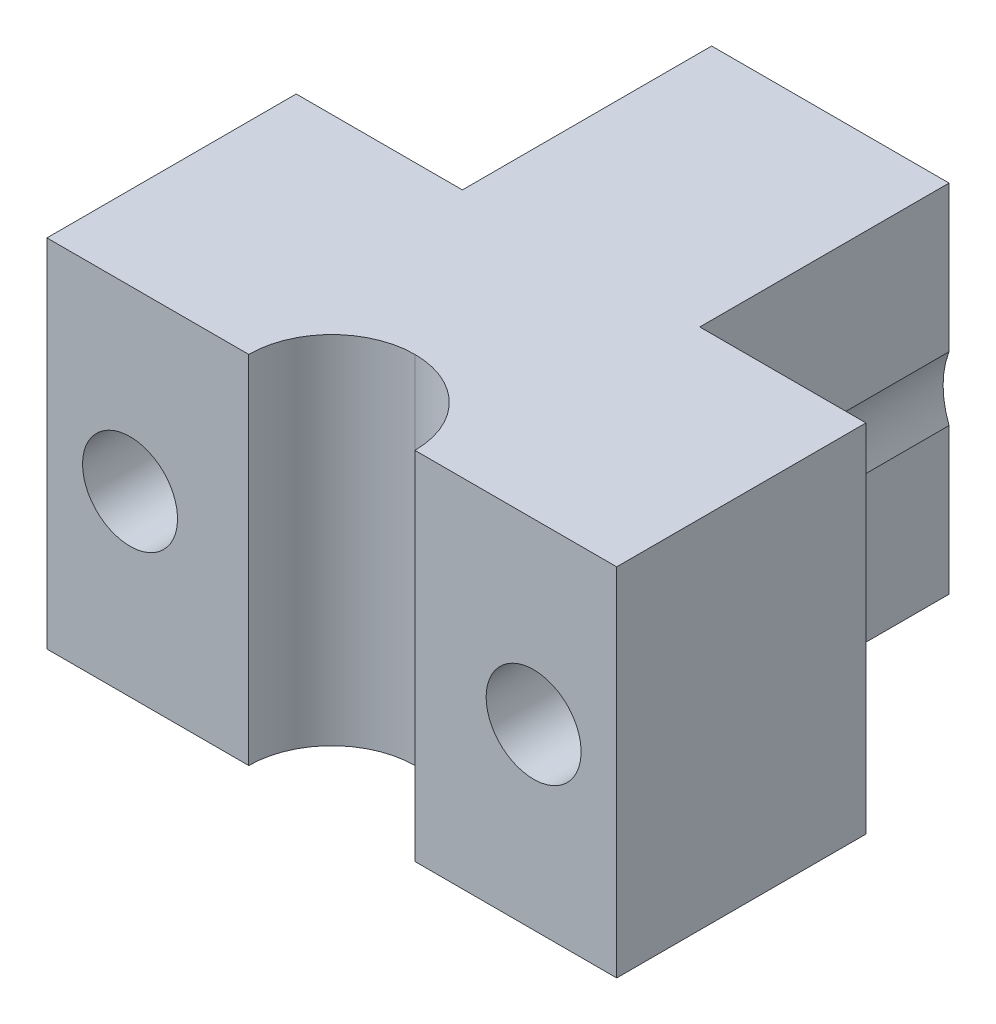
ISO-10303-21;
HEADER;
FILE_DESCRIPTION(('STEP AP214'),'2;1');
FILE_NAME('part.step','',(''),(''),'','','');
FILE_SCHEMA(('AUTOMOTIVE_DESIGN { 1 0 10303 214 1 1 1 1 }'));
ENDSEC;
DATA;
#1=APPLICATION_CONTEXT('core data for automotive mechanical design processes');
#2=APPLICATION_PROTOCOL_DEFINITION('international standard','automotive_design',2000,#1);
#3=PRODUCT_CONTEXT('',#1,'mechanical');
#4=PRODUCT('Part','Part','',(#3));
#5=PRODUCT_RELATED_PRODUCT_CATEGORY('part','',(#4));
#6=PRODUCT_DEFINITION_FORMATION('','',#4);
#7=PRODUCT_DEFINITION_CONTEXT('part definition',#1,'design');
#8=PRODUCT_DEFINITION('design','',#6,#7);
#9=PRODUCT_DEFINITION_SHAPE('','',#8);
#10=(LENGTH_UNIT() NAMED_UNIT(*) SI_UNIT(.MILLI.,.METRE.));
#11=(NAMED_UNIT(*) PLANE_ANGLE_UNIT() SI_UNIT($,.RADIAN.));
#12=(NAMED_UNIT(*) SI_UNIT($,.STERADIAN.) SOLID_ANGLE_UNIT());
#13=UNCERTAINTY_MEASURE_WITH_UNIT(LENGTH_MEASURE(1.E-05),#10,'distance_accuracy_value','');
#14=(GEOMETRIC_REPRESENTATION_CONTEXT(3) GLOBAL_UNCERTAINTY_ASSIGNED_CONTEXT((#13)) GLOBAL_UNIT_ASSIGNED_CONTEXT((#10,
#11,#12)) REPRESENTATION_CONTEXT('',''));
#15=CARTESIAN_POINT('',(0.,0.,0.));
#16=DIRECTION('',(0.,0.,1.));
#17=DIRECTION('',(1.,0.,0.));
#18=AXIS2_PLACEMENT_3D('',#15,#16,#17);
#19=CARTESIAN_POINT('',(-10.,0.,0.));
#20=DIRECTION('',(1.,0.,0.));
#21=DIRECTION('',(0.,0.,-1.));
#22=AXIS2_PLACEMENT_3D('',#19,#20,#21);
#23=PLANE('',#22);
#24=DIRECTION('',(0.,0.,1.));
#25=VECTOR('',#24,1.);
#26=CARTESIAN_POINT('',(-10.,17.6925824035673,-32.));
#27=LINE('',#26,#25);
#28=CARTESIAN_POINT('',(-10.,17.6925824035673,-11.));
#29=VERTEX_POINT('',#28);
#30=CARTESIAN_POINT('',(-10.,17.6925824035673,-16.4));
#31=VERTEX_POINT('',#30);
#32=EDGE_CURVE('E11',#29,#31,#27,.F.);
#33=ORIENTED_EDGE('',*,*,#32,.F.);
#34=DIRECTION('',(0.,1.,0.));
#35=VECTOR('',#34,1.);
#36=CARTESIAN_POINT('',(-10.,0.,-11.));
#37=LINE('',#36,#35);
#38=CARTESIAN_POINT('',(-10.,30.,-11.));
#39=VERTEX_POINT('',#38);
#40=EDGE_CURVE('E186',#29,#39,#37,.T.);
#41=ORIENTED_EDGE('',*,*,#40,.T.);
#42=DIRECTION('',(0.,0.,-1.));
#43=VECTOR('',#42,1.);
#44=CARTESIAN_POINT('',(-10.,30.,-11.));
#45=LINE('',#44,#43);
#46=CARTESIAN_POINT('',(-10.,30.,-32.));
#47=VERTEX_POINT('',#46);
#48=EDGE_CURVE('E198',#39,#47,#45,.T.);
#49=ORIENTED_EDGE('',*,*,#48,.T.);
#50=DIRECTION('',(0.,-1.,0.));
#51=VECTOR('',#50,1.);
#52=CARTESIAN_POINT('',(-10.,0.,-32.));
#53=LINE('',#52,#51);
#54=CARTESIAN_POINT('',(-10.,17.6925824035673,-32.));
#55=VERTEX_POINT('',#54);
#56=EDGE_CURVE('E206',#47,#55,#53,.T.);
#57=ORIENTED_EDGE('',*,*,#56,.T.);
#58=CARTESIAN_POINT('',(-10.,17.6925824035673,-26.6));
#59=VERTEX_POINT('',#58);
#60=EDGE_CURVE('E41',#59,#55,#27,.F.);
#61=ORIENTED_EDGE('',*,*,#60,.F.);
#62=DIRECTION('',(0.,-1.,0.));
#63=VECTOR('',#62,1.);
#64=CARTESIAN_POINT('',(-10.,4.9,-26.6));
#65=LINE('',#64,#63);
#66=CARTESIAN_POINT('',(-10.,25.1,-26.6));
#67=VERTEX_POINT('',#66);
#68=EDGE_CURVE('E352',#67,#59,#65,.T.);
#69=ORIENTED_EDGE('',*,*,#68,.F.);
#70=DIRECTION('',(0.,0.,-1.));
#71=VECTOR('',#70,1.);
#72=CARTESIAN_POINT('',(-10.,25.1,-16.4));
#73=LINE('',#72,#71);
#74=CARTESIAN_POINT('',(-10.,25.1,-16.4));
#75=VERTEX_POINT('',#74);
#76=EDGE_CURVE('E348',#75,#67,#73,.T.);
#77=ORIENTED_EDGE('',*,*,#76,.F.);
#78=DIRECTION('',(0.,1.,0.));
#79=VECTOR('',#78,1.);
#80=CARTESIAN_POINT('',(-10.,4.9,-16.4));
#81=LINE('',#80,#79);
#82=EDGE_CURVE('E189',#31,#75,#81,.T.);
#83=ORIENTED_EDGE('',*,*,#82,.F.);
#84=EDGE_LOOP('',(#33,#41,#49,#57,#61,#69,#77,#83));
#85=FACE_BOUND('',#84,.T.);
#86=ADVANCED_FACE('F37',(#85),#23,.F.);
#87=DIRECTION('',(0.,0.,1.));
#88=VECTOR('',#87,1.);
#89=CARTESIAN_POINT('',(-10.,12.3074175964327,-32.));
#90=LINE('',#89,#88);
#91=CARTESIAN_POINT('',(-10.,12.3074175964327,-32.));
#92=VERTEX_POINT('',#91);
#93=CARTESIAN_POINT('',(-10.,12.3074175964327,-26.6));
#94=VERTEX_POINT('',#93);
#95=EDGE_CURVE('E287',#92,#94,#90,.T.);
#96=ORIENTED_EDGE('',*,*,#95,.F.);
#97=CARTESIAN_POINT('',(-10.,0.,-32.));
#98=VERTEX_POINT('',#97);
#99=EDGE_CURVE('E205',#92,#98,#53,.T.);
#100=ORIENTED_EDGE('',*,*,#99,.T.);
#101=DIRECTION('',(0.,0.,1.));
#102=VECTOR('',#101,1.);
#103=CARTESIAN_POINT('',(-10.,0.,-11.));
#104=LINE('',#103,#102);
#105=CARTESIAN_POINT('',(-10.,0.,-11.));
#106=VERTEX_POINT('',#105);
#107=EDGE_CURVE('E196',#98,#106,#104,.T.);
#108=ORIENTED_EDGE('',*,*,#107,.T.);
#109=CARTESIAN_POINT('',(-10.,12.3074175964327,-11.));
#110=VERTEX_POINT('',#109);
#111=EDGE_CURVE('E195',#106,#110,#37,.T.);
#112=ORIENTED_EDGE('',*,*,#111,.T.);
#113=CARTESIAN_POINT('',(-10.,12.3074175964327,-16.4));
#114=VERTEX_POINT('',#113);
#115=EDGE_CURVE('E181',#114,#110,#90,.T.);
#116=ORIENTED_EDGE('',*,*,#115,.F.);
#117=CARTESIAN_POINT('',(-10.,4.9,-16.4));
#118=VERTEX_POINT('',#117);
#119=EDGE_CURVE('E345',#118,#114,#81,.T.);
#120=ORIENTED_EDGE('',*,*,#119,.F.);
#121=DIRECTION('',(0.,0.,1.));
#122=VECTOR('',#121,1.);
#123=CARTESIAN_POINT('',(-10.,4.9,-16.4));
#124=LINE('',#123,#122);
#125=CARTESIAN_POINT('',(-10.,4.9,-26.6));
#126=VERTEX_POINT('',#125);
#127=EDGE_CURVE('E340',#126,#118,#124,.T.);
#128=ORIENTED_EDGE('',*,*,#127,.F.);
#129=EDGE_CURVE('E351',#94,#126,#65,.T.);
#130=ORIENTED_EDGE('',*,*,#129,.F.);
#131=EDGE_LOOP('',(#96,#100,#108,#112,#116,#120,#128,#130));
#132=FACE_BOUND('',#131,.T.);
#133=ADVANCED_FACE('F373',(#132),#23,.F.);
#134=CARTESIAN_POINT('',(10.,0.,0.));
#135=DIRECTION('',(1.,0.,0.));
#136=DIRECTION('',(0.,0.,-1.));
#137=AXIS2_PLACEMENT_3D('',#134,#135,#136);
#138=PLANE('',#137);
#139=DIRECTION('',(0.,-1.,0.));
#140=VECTOR('',#139,1.);
#141=CARTESIAN_POINT('',(10.,0.,-11.));
#142=LINE('',#141,#140);
#143=CARTESIAN_POINT('',(10.,30.,-11.));
#144=VERTEX_POINT('',#143);
#145=CARTESIAN_POINT('',(10.,17.6925824035672,-11.));
#146=VERTEX_POINT('',#145);
#147=EDGE_CURVE('E225',#144,#146,#142,.T.);
#148=ORIENTED_EDGE('',*,*,#147,.T.);
#149=DIRECTION('',(0.,0.,1.));
#150=VECTOR('',#149,1.);
#151=CARTESIAN_POINT('',(10.,17.6925824035672,-32.));
#152=LINE('',#151,#150);
#153=CARTESIAN_POINT('',(10.,17.6925824035672,-32.));
#154=VERTEX_POINT('',#153);
#155=EDGE_CURVE('E285',#146,#154,#152,.F.);
#156=ORIENTED_EDGE('',*,*,#155,.T.);
#157=DIRECTION('',(0.,1.,0.));
#158=VECTOR('',#157,1.);
#159=CARTESIAN_POINT('',(10.,0.,-32.));
#160=LINE('',#159,#158);
#161=CARTESIAN_POINT('',(10.,30.,-32.));
#162=VERTEX_POINT('',#161);
#163=EDGE_CURVE('E218',#154,#162,#160,.T.);
#164=ORIENTED_EDGE('',*,*,#163,.T.);
#165=DIRECTION('',(0.,0.,1.));
#166=VECTOR('',#165,1.);
#167=CARTESIAN_POINT('',(10.,30.,-11.));
#168=LINE('',#167,#166);
#169=EDGE_CURVE('E222',#162,#144,#168,.T.);
#170=ORIENTED_EDGE('',*,*,#169,.T.);
#171=EDGE_LOOP('',(#148,#156,#164,#170));
#172=FACE_BOUND('',#171,.T.);
#173=ADVANCED_FACE('F312',(#172),#138,.T.);
#174=CARTESIAN_POINT('',(10.,0.,-32.));
#175=VERTEX_POINT('',#174);
#176=CARTESIAN_POINT('',(10.,12.3074175964328,-32.));
#177=VERTEX_POINT('',#176);
#178=EDGE_CURVE('E219',#175,#177,#160,.T.);
#179=ORIENTED_EDGE('',*,*,#178,.T.);
#180=DIRECTION('',(0.,0.,1.));
#181=VECTOR('',#180,1.);
#182=CARTESIAN_POINT('',(10.,12.3074175964328,-32.));
#183=LINE('',#182,#181);
#184=CARTESIAN_POINT('',(10.,12.3074175964328,-11.));
#185=VERTEX_POINT('',#184);
#186=EDGE_CURVE('E277',#177,#185,#183,.T.);
#187=ORIENTED_EDGE('',*,*,#186,.T.);
#188=CARTESIAN_POINT('',(10.,0.,-11.));
#189=VERTEX_POINT('',#188);
#190=EDGE_CURVE('E224',#185,#189,#142,.T.);
#191=ORIENTED_EDGE('',*,*,#190,.T.);
#192=DIRECTION('',(0.,0.,-1.));
#193=VECTOR('',#192,1.);
#194=CARTESIAN_POINT('',(10.,0.,-11.));
#195=LINE('',#194,#193);
#196=EDGE_CURVE('E215',#189,#175,#195,.T.);
#197=ORIENTED_EDGE('',*,*,#196,.T.);
#198=EDGE_LOOP('',(#179,#187,#191,#197));
#199=FACE_BOUND('',#198,.T.);
#200=ADVANCED_FACE('F412',(#199),#138,.T.);
#201=CARTESIAN_POINT('',(24.,4.9,-16.4));
#202=DIRECTION('',(0.,-1.,0.));
#203=DIRECTION('',(0.,0.,-1.));
#204=AXIS2_PLACEMENT_3D('',#201,#202,#203);
#205=PLANE('',#204);
#206=DIRECTION('',(0.,0.,-1.));
#207=VECTOR('',#206,1.);
#208=CARTESIAN_POINT('',(6.,4.9,-26.6));
#209=LINE('',#208,#207);
#210=CARTESIAN_POINT('',(6.,4.9,-16.4));
#211=VERTEX_POINT('',#210);
#212=CARTESIAN_POINT('',(6.,4.9,-26.6));
#213=VERTEX_POINT('',#212);
#214=EDGE_CURVE('E320',#211,#213,#209,.T.);
#215=ORIENTED_EDGE('',*,*,#214,.T.);
#216=DIRECTION('',(-1.,0.,0.));
#217=VECTOR('',#216,1.);
#218=CARTESIAN_POINT('',(24.,4.9,-26.6));
#219=LINE('',#218,#217);
#220=EDGE_CURVE('E211',#213,#126,#219,.T.);
#221=ORIENTED_EDGE('',*,*,#220,.T.);
#222=ORIENTED_EDGE('',*,*,#127,.T.);
#223=DIRECTION('',(-1.,0.,0.));
#224=VECTOR('',#223,1.);
#225=CARTESIAN_POINT('',(24.,4.9,-16.4));
#226=LINE('',#225,#224);
#227=EDGE_CURVE('E354',#211,#118,#226,.T.);
#228=ORIENTED_EDGE('',*,*,#227,.F.);
#229=EDGE_LOOP('',(#215,#221,#222,#228));
#230=FACE_BOUND('',#229,.T.);
#231=ADVANCED_FACE('F369',(#230),#205,.F.);
#232=CARTESIAN_POINT('',(24.,4.9,-26.6));
#233=DIRECTION('',(0.,0.,-1.));
#234=DIRECTION('',(-1.,0.,0.));
#235=AXIS2_PLACEMENT_3D('',#232,#233,#234);
#236=PLANE('',#235);
#237=CARTESIAN_POINT('',(-17.,15.,-26.6));
#238=DIRECTION('',(0.,0.,-1.));
#239=DIRECTION('',(-1.,0.,0.));
#240=AXIS2_PLACEMENT_3D('',#237,#238,#239);
#241=CIRCLE('',#240,7.5);
#242=EDGE_CURVE('E291',#94,#59,#241,.F.);
#243=ORIENTED_EDGE('',*,*,#242,.F.);
#244=ORIENTED_EDGE('',*,*,#129,.T.);
#245=ORIENTED_EDGE('',*,*,#220,.F.);
#246=DIRECTION('',(0.,1.,0.));
#247=VECTOR('',#246,1.);
#248=CARTESIAN_POINT('',(6.,4.9,-26.6));
#249=LINE('',#248,#247);
#250=CARTESIAN_POINT('',(6.,25.1,-26.6));
#251=VERTEX_POINT('',#250);
#252=EDGE_CURVE('E327',#213,#251,#249,.T.);
#253=ORIENTED_EDGE('',*,*,#252,.T.);
#254=DIRECTION('',(-1.,0.,0.));
#255=VECTOR('',#254,1.);
#256=CARTESIAN_POINT('',(24.,25.1,-26.6));
#257=LINE('',#256,#255);
#258=EDGE_CURVE('E357',#251,#67,#257,.T.);
#259=ORIENTED_EDGE('',*,*,#258,.T.);
#260=ORIENTED_EDGE('',*,*,#68,.T.);
#261=EDGE_LOOP('',(#243,#244,#245,#253,#259,#260));
#262=FACE_BOUND('',#261,.T.);
#263=ADVANCED_FACE('F419',(#262),#236,.F.);
#264=CARTESIAN_POINT('',(24.,25.1,-16.4));
#265=DIRECTION('',(0.,1.,0.));
#266=DIRECTION('',(0.,0.,1.));
#267=AXIS2_PLACEMENT_3D('',#264,#265,#266);
#268=PLANE('',#267);
#269=DIRECTION('',(0.,0.,1.));
#270=VECTOR('',#269,1.);
#271=CARTESIAN_POINT('',(6.,25.1,-26.6));
#272=LINE('',#271,#270);
#273=CARTESIAN_POINT('',(6.,25.1,-16.4));
#274=VERTEX_POINT('',#273);
#275=EDGE_CURVE('E282',#251,#274,#272,.T.);
#276=ORIENTED_EDGE('',*,*,#275,.T.);
#277=DIRECTION('',(-1.,0.,0.));
#278=VECTOR('',#277,1.);
#279=CARTESIAN_POINT('',(24.,25.1,-16.4));
#280=LINE('',#279,#278);
#281=EDGE_CURVE('E359',#274,#75,#280,.T.);
#282=ORIENTED_EDGE('',*,*,#281,.T.);
#283=ORIENTED_EDGE('',*,*,#76,.T.);
#284=ORIENTED_EDGE('',*,*,#258,.F.);
#285=EDGE_LOOP('',(#276,#282,#283,#284));
#286=FACE_BOUND('',#285,.T.);
#287=ADVANCED_FACE('F474',(#286),#268,.F.);
#288=CARTESIAN_POINT('',(24.,4.9,-16.4));
#289=DIRECTION('',(0.,0.,1.));
#290=DIRECTION('',(1.,0.,0.));
#291=AXIS2_PLACEMENT_3D('',#288,#289,#290);
#292=PLANE('',#291);
#293=CARTESIAN_POINT('',(-17.,15.,-16.4));
#294=DIRECTION('',(0.,0.,1.));
#295=DIRECTION('',(1.,0.,0.));
#296=AXIS2_PLACEMENT_3D('',#293,#294,#295);
#297=CIRCLE('',#296,7.5);
#298=EDGE_CURVE('E300',#31,#114,#297,.F.);
#299=ORIENTED_EDGE('',*,*,#298,.F.);
#300=ORIENTED_EDGE('',*,*,#82,.T.);
#301=ORIENTED_EDGE('',*,*,#281,.F.);
#302=DIRECTION('',(0.,-1.,0.));
#303=VECTOR('',#302,1.);
#304=CARTESIAN_POINT('',(6.,4.9,-16.4));
#305=LINE('',#304,#303);
#306=EDGE_CURVE('E318',#274,#211,#305,.T.);
#307=ORIENTED_EDGE('',*,*,#306,.T.);
#308=ORIENTED_EDGE('',*,*,#227,.T.);
#309=ORIENTED_EDGE('',*,*,#119,.T.);
#310=EDGE_LOOP('',(#299,#300,#301,#307,#308,#309));
#311=FACE_BOUND('',#310,.T.);
#312=ADVANCED_FACE('F363',(#311),#292,.F.);
#313=CARTESIAN_POINT('',(-24.,0.,-32.));
#314=DIRECTION('',(0.,0.,1.));
#315=DIRECTION('',(1.,0.,0.));
#316=AXIS2_PLACEMENT_3D('',#313,#314,#315);
#317=PLANE('',#316);
#318=CARTESIAN_POINT('',(-17.,15.,-32.));
#319=DIRECTION('',(0.,0.,-1.));
#320=DIRECTION('',(-1.,0.,0.));
#321=AXIS2_PLACEMENT_3D('',#318,#319,#320);
#322=CIRCLE('',#321,7.5);
#323=EDGE_CURVE('E52',#55,#92,#322,.T.);
#324=ORIENTED_EDGE('',*,*,#323,.F.);
#325=ORIENTED_EDGE('',*,*,#56,.F.);
#326=DIRECTION('',(1.,0.,0.));
#327=VECTOR('',#326,1.);
#328=CARTESIAN_POINT('',(-24.,30.,-32.));
#329=LINE('',#328,#327);
#330=EDGE_CURVE('E235',#47,#162,#329,.T.);
#331=ORIENTED_EDGE('',*,*,#330,.T.);
#332=ORIENTED_EDGE('',*,*,#163,.F.);
#333=CARTESIAN_POINT('',(17.,15.,-32.));
#334=DIRECTION('',(0.,0.,-1.));
#335=DIRECTION('',(-1.,0.,0.));
#336=AXIS2_PLACEMENT_3D('',#333,#334,#335);
#337=CIRCLE('',#336,7.5);
#338=EDGE_CURVE('E310',#177,#154,#337,.T.);
#339=ORIENTED_EDGE('',*,*,#338,.F.);
#340=ORIENTED_EDGE('',*,*,#178,.F.);
#341=DIRECTION('',(1.,0.,0.));
#342=VECTOR('',#341,1.);
#343=CARTESIAN_POINT('',(-24.,0.,-32.));
#344=LINE('',#343,#342);
#345=EDGE_CURVE('E233',#98,#175,#344,.T.);
#346=ORIENTED_EDGE('',*,*,#345,.F.);
#347=ORIENTED_EDGE('',*,*,#99,.F.);
#348=EDGE_LOOP('',(#324,#325,#331,#332,#339,#340,#346,#347));
#349=FACE_BOUND('',#348,.T.);
#350=ADVANCED_FACE('F297',(#349),#317,.F.);
#351=CARTESIAN_POINT('',(-24.,30.,10.));
#352=DIRECTION('',(0.,0.,-1.));
#353=DIRECTION('',(-1.,0.,0.));
#354=AXIS2_PLACEMENT_3D('',#351,#352,#353);
#355=PLANE('',#354);
#356=CARTESIAN_POINT('',(17.,15.,10.));
#357=DIRECTION('',(0.,0.,-1.));
#358=DIRECTION('',(-1.,0.,0.));
#359=AXIS2_PLACEMENT_3D('',#356,#357,#358);
#360=CIRCLE('',#359,4.);
#361=CARTESIAN_POINT('',(13.,15.,10.));
#362=VERTEX_POINT('',#361);
#363=EDGE_CURVE('E331',#362,#362,#360,.T.);
#364=ORIENTED_EDGE('',*,*,#363,.T.);
#365=EDGE_LOOP('',(#364));
#366=FACE_BOUND('',#365,.T.);
#367=DIRECTION('',(1.,0.,0.));
#368=VECTOR('',#367,1.);
#369=CARTESIAN_POINT('',(-24.,30.,10.));
#370=LINE('',#369,#368);
#371=CARTESIAN_POINT('',(7.,30.,10.));
#372=VERTEX_POINT('',#371);
#373=CARTESIAN_POINT('',(24.,30.,10.));
#374=VERTEX_POINT('',#373);
#375=EDGE_CURVE('E252',#372,#374,#370,.T.);
#376=ORIENTED_EDGE('',*,*,#375,.F.);
#377=DIRECTION('',(0.,1.,0.));
#378=VECTOR('',#377,1.);
#379=CARTESIAN_POINT('',(7.,0.,10.));
#380=LINE('',#379,#378);
#381=CARTESIAN_POINT('',(7.,0.,10.));
#382=VERTEX_POINT('',#381);
#383=EDGE_CURVE('E242',#382,#372,#380,.T.);
#384=ORIENTED_EDGE('',*,*,#383,.F.);
#385=DIRECTION('',(1.,0.,0.));
#386=VECTOR('',#385,1.);
#387=CARTESIAN_POINT('',(-24.,0.,10.));
#388=LINE('',#387,#386);
#389=CARTESIAN_POINT('',(24.,0.,10.));
#390=VERTEX_POINT('',#389);
#391=EDGE_CURVE('E261',#382,#390,#388,.T.);
#392=ORIENTED_EDGE('',*,*,#391,.T.);
#393=DIRECTION('',(0.,-1.,0.));
#394=VECTOR('',#393,1.);
#395=CARTESIAN_POINT('',(24.,30.,10.));
#396=LINE('',#395,#394);
#397=EDGE_CURVE('E256',#374,#390,#396,.T.);
#398=ORIENTED_EDGE('',*,*,#397,.F.);
#399=EDGE_LOOP('',(#376,#384,#392,#398));
#400=FACE_BOUND('',#399,.T.);
#401=ADVANCED_FACE('F398',(#366,#400),#355,.F.);
#402=CARTESIAN_POINT('',(24.,30.,10.));
#403=DIRECTION('',(-1.,0.,0.));
#404=DIRECTION('',(0.,0.,1.));
#405=AXIS2_PLACEMENT_3D('',#402,#403,#404);
#406=PLANE('',#405);
#407=DIRECTION('',(0.,0.,-1.));
#408=VECTOR('',#407,1.);
#409=CARTESIAN_POINT('',(24.,0.,10.));
#410=LINE('',#409,#408);
#411=CARTESIAN_POINT('',(24.,0.,-11.));
#412=VERTEX_POINT('',#411);
#413=EDGE_CURVE('E245',#390,#412,#410,.T.);
#414=ORIENTED_EDGE('',*,*,#413,.T.);
#415=DIRECTION('',(0.,-1.,0.));
#416=VECTOR('',#415,1.);
#417=CARTESIAN_POINT('',(24.,0.,-11.));
#418=LINE('',#417,#416);
#419=CARTESIAN_POINT('',(24.,30.,-11.));
#420=VERTEX_POINT('',#419);
#421=EDGE_CURVE('E213',#420,#412,#418,.T.);
#422=ORIENTED_EDGE('',*,*,#421,.F.);
#423=DIRECTION('',(0.,0.,-1.));
#424=VECTOR('',#423,1.);
#425=CARTESIAN_POINT('',(24.,30.,10.));
#426=LINE('',#425,#424);
#427=EDGE_CURVE('E246',#374,#420,#426,.T.);
#428=ORIENTED_EDGE('',*,*,#427,.F.);
#429=ORIENTED_EDGE('',*,*,#397,.T.);
#430=EDGE_LOOP('',(#414,#422,#428,#429));
#431=FACE_BOUND('',#430,.T.);
#432=ADVANCED_FACE('F405',(#431),#406,.F.);
#433=CARTESIAN_POINT('',(-24.,30.,10.));
#434=DIRECTION('',(1.,0.,0.));
#435=DIRECTION('',(0.,0.,-1.));
#436=AXIS2_PLACEMENT_3D('',#433,#434,#435);
#437=PLANE('',#436);
#438=DIRECTION('',(0.,0.,1.));
#439=VECTOR('',#438,1.);
#440=CARTESIAN_POINT('',(-24.,30.,10.));
#441=LINE('',#440,#439);
#442=CARTESIAN_POINT('',(-24.,30.,-11.));
#443=VERTEX_POINT('',#442);
#444=CARTESIAN_POINT('',(-24.,30.,10.));
#445=VERTEX_POINT('',#444);
#446=EDGE_CURVE('E249',#443,#445,#441,.T.);
#447=ORIENTED_EDGE('',*,*,#446,.F.);
#448=DIRECTION('',(0.,1.,0.));
#449=VECTOR('',#448,1.);
#450=CARTESIAN_POINT('',(-24.,0.,-11.));
#451=LINE('',#450,#449);
#452=CARTESIAN_POINT('',(-24.,0.,-11.));
#453=VERTEX_POINT('',#452);
#454=EDGE_CURVE('E200',#453,#443,#451,.T.);
#455=ORIENTED_EDGE('',*,*,#454,.F.);
#456=DIRECTION('',(0.,0.,1.));
#457=VECTOR('',#456,1.);
#458=CARTESIAN_POINT('',(-24.,0.,10.));
#459=LINE('',#458,#457);
#460=CARTESIAN_POINT('',(-24.,0.,10.));
#461=VERTEX_POINT('',#460);
#462=EDGE_CURVE('E259',#453,#461,#459,.T.);
#463=ORIENTED_EDGE('',*,*,#462,.T.);
#464=DIRECTION('',(0.,-1.,0.));
#465=VECTOR('',#464,1.);
#466=CARTESIAN_POINT('',(-24.,30.,10.));
#467=LINE('',#466,#465);
#468=EDGE_CURVE('E266',#445,#461,#467,.T.);
#469=ORIENTED_EDGE('',*,*,#468,.F.);
#470=EDGE_LOOP('',(#447,#455,#463,#469));
#471=FACE_BOUND('',#470,.T.);
#472=ADVANCED_FACE('F380',(#471),#437,.F.);
#473=CARTESIAN_POINT('',(-17.,15.,10.));
#474=DIRECTION('',(0.,0.,-1.));
#475=DIRECTION('',(-1.,0.,0.));
#476=AXIS2_PLACEMENT_3D('',#473,#474,#475);
#477=CIRCLE('',#476,4.);
#478=CARTESIAN_POINT('',(-21.,15.,10.));
#479=VERTEX_POINT('',#478);
#480=EDGE_CURVE('E337',#479,#479,#477,.T.);
#481=ORIENTED_EDGE('',*,*,#480,.T.);
#482=EDGE_LOOP('',(#481));
#483=FACE_BOUND('',#482,.T.);
#484=CARTESIAN_POINT('',(-7.,0.,10.));
#485=VERTEX_POINT('',#484);
#486=EDGE_CURVE('E250',#461,#485,#388,.T.);
#487=ORIENTED_EDGE('',*,*,#486,.T.);
#488=DIRECTION('',(0.,-1.,0.));
#489=VECTOR('',#488,1.);
#490=CARTESIAN_POINT('',(-7.00000000000001,30.,10.));
#491=LINE('',#490,#489);
#492=CARTESIAN_POINT('',(-7.00000000000001,30.,10.));
#493=VERTEX_POINT('',#492);
#494=EDGE_CURVE('E238',#493,#485,#491,.T.);
#495=ORIENTED_EDGE('',*,*,#494,.F.);
#496=EDGE_CURVE('E253',#445,#493,#370,.T.);
#497=ORIENTED_EDGE('',*,*,#496,.F.);
#498=ORIENTED_EDGE('',*,*,#468,.T.);
#499=EDGE_LOOP('',(#487,#495,#497,#498));
#500=FACE_BOUND('',#499,.T.);
#501=ADVANCED_FACE('F387',(#483,#500),#355,.F.);
#502=CARTESIAN_POINT('',(0.,30.,0.));
#503=DIRECTION('',(0.,-1.,0.));
#504=DIRECTION('',(0.,0.,-1.));
#505=AXIS2_PLACEMENT_3D('',#502,#503,#504);
#506=PLANE('',#505);
#507=ORIENTED_EDGE('',*,*,#48,.F.);
#508=DIRECTION('',(-1.,0.,0.));
#509=VECTOR('',#508,1.);
#510=CARTESIAN_POINT('',(-10.,30.,-11.));
#511=LINE('',#510,#509);
#512=EDGE_CURVE('E193',#39,#443,#511,.T.);
#513=ORIENTED_EDGE('',*,*,#512,.T.);
#514=ORIENTED_EDGE('',*,*,#446,.T.);
#515=ORIENTED_EDGE('',*,*,#496,.T.);
#516=CARTESIAN_POINT('',(0.,30.,10.));
#517=DIRECTION('',(0.,-1.,0.));
#518=DIRECTION('',(0.,0.,-1.));
#519=AXIS2_PLACEMENT_3D('',#516,#517,#518);
#520=CIRCLE('',#519,7.);
#521=CARTESIAN_POINT('',(0.,30.,3.));
#522=VERTEX_POINT('',#521);
#523=EDGE_CURVE('E271',#493,#522,#520,.T.);
#524=ORIENTED_EDGE('',*,*,#523,.T.);
#525=CARTESIAN_POINT('',(0.,30.,10.));
#526=DIRECTION('',(0.,-1.,0.));
#527=DIRECTION('',(0.,0.,-1.));
#528=AXIS2_PLACEMENT_3D('',#525,#526,#527);
#529=CIRCLE('',#528,7.);
#530=EDGE_CURVE('E273',#522,#372,#529,.T.);
#531=ORIENTED_EDGE('',*,*,#530,.T.);
#532=ORIENTED_EDGE('',*,*,#375,.T.);
#533=ORIENTED_EDGE('',*,*,#427,.T.);
#534=DIRECTION('',(1.,0.,0.));
#535=VECTOR('',#534,1.);
#536=CARTESIAN_POINT('',(10.,30.,-11.));
#537=LINE('',#536,#535);
#538=EDGE_CURVE('E228',#144,#420,#537,.T.);
#539=ORIENTED_EDGE('',*,*,#538,.F.);
#540=ORIENTED_EDGE('',*,*,#169,.F.);
#541=ORIENTED_EDGE('',*,*,#330,.F.);
#542=EDGE_LOOP('',(#507,#513,#514,#515,#524,#531,#532,#533,#539,#540,#541));
#543=FACE_BOUND('',#542,.T.);
#544=ADVANCED_FACE('F303',(#543),#506,.F.);
#545=CARTESIAN_POINT('',(0.,0.,0.));
#546=DIRECTION('',(0.,-1.,0.));
#547=DIRECTION('',(0.,0.,-1.));
#548=AXIS2_PLACEMENT_3D('',#545,#546,#547);
#549=PLANE('',#548);
#550=DIRECTION('',(-1.,0.,0.));
#551=VECTOR('',#550,1.);
#552=CARTESIAN_POINT('',(-10.,0.,-11.));
#553=LINE('',#552,#551);
#554=EDGE_CURVE('E209',#106,#453,#553,.T.);
#555=ORIENTED_EDGE('',*,*,#554,.F.);
#556=ORIENTED_EDGE('',*,*,#107,.F.);
#557=ORIENTED_EDGE('',*,*,#345,.T.);
#558=ORIENTED_EDGE('',*,*,#196,.F.);
#559=DIRECTION('',(1.,0.,0.));
#560=VECTOR('',#559,1.);
#561=CARTESIAN_POINT('',(10.,0.,-11.));
#562=LINE('',#561,#560);
#563=EDGE_CURVE('E230',#189,#412,#562,.T.);
#564=ORIENTED_EDGE('',*,*,#563,.T.);
#565=ORIENTED_EDGE('',*,*,#413,.F.);
#566=ORIENTED_EDGE('',*,*,#391,.F.);
#567=CARTESIAN_POINT('',(0.,0.,10.));
#568=DIRECTION('',(0.,-1.,0.));
#569=DIRECTION('',(0.,0.,-1.));
#570=AXIS2_PLACEMENT_3D('',#567,#568,#569);
#571=CIRCLE('',#570,7.);
#572=CARTESIAN_POINT('',(0.,0.,3.));
#573=VERTEX_POINT('',#572);
#574=EDGE_CURVE('E275',#382,#573,#571,.F.);
#575=ORIENTED_EDGE('',*,*,#574,.T.);
#576=CARTESIAN_POINT('',(0.,0.,10.));
#577=DIRECTION('',(0.,-1.,0.));
#578=DIRECTION('',(0.,0.,-1.));
#579=AXIS2_PLACEMENT_3D('',#576,#577,#578);
#580=CIRCLE('',#579,7.);
#581=EDGE_CURVE('E269',#573,#485,#580,.F.);
#582=ORIENTED_EDGE('',*,*,#581,.T.);
#583=ORIENTED_EDGE('',*,*,#486,.F.);
#584=ORIENTED_EDGE('',*,*,#462,.F.);
#585=EDGE_LOOP('',(#555,#556,#557,#558,#564,#565,#566,#575,#582,#583,#584));
#586=FACE_BOUND('',#585,.T.);
#587=ADVANCED_FACE('F383',(#586),#549,.T.);
#588=CARTESIAN_POINT('',(10.,0.,-11.));
#589=DIRECTION('',(0.,0.,1.));
#590=DIRECTION('',(0.,-1.,0.));
#591=AXIS2_PLACEMENT_3D('',#588,#589,#590);
#592=PLANE('',#591);
#593=ORIENTED_EDGE('',*,*,#190,.F.);
#594=CARTESIAN_POINT('',(17.,15.,-11.));
#595=DIRECTION('',(0.,0.,-1.));
#596=DIRECTION('',(-1.,0.,0.));
#597=AXIS2_PLACEMENT_3D('',#594,#595,#596);
#598=CIRCLE('',#597,7.5);
#599=EDGE_CURVE('E317',#185,#146,#598,.T.);
#600=ORIENTED_EDGE('',*,*,#599,.T.);
#601=ORIENTED_EDGE('',*,*,#147,.F.);
#602=ORIENTED_EDGE('',*,*,#538,.T.);
#603=ORIENTED_EDGE('',*,*,#421,.T.);
#604=ORIENTED_EDGE('',*,*,#563,.F.);
#605=EDGE_LOOP('',(#593,#600,#601,#602,#603,#604));
#606=FACE_BOUND('',#605,.T.);
#607=CARTESIAN_POINT('',(17.,15.,-11.));
#608=DIRECTION('',(0.,0.,-1.));
#609=DIRECTION('',(-1.,0.,0.));
#610=AXIS2_PLACEMENT_3D('',#607,#608,#609);
#611=CIRCLE('',#610,4.);
#612=CARTESIAN_POINT('',(13.,15.,-11.));
#613=VERTEX_POINT('',#612);
#614=EDGE_CURVE('E281',#613,#613,#611,.T.);
#615=ORIENTED_EDGE('',*,*,#614,.F.);
#616=EDGE_LOOP('',(#615));
#617=FACE_BOUND('',#616,.T.);
#618=ADVANCED_FACE('F409',(#606,#617),#592,.F.);
#619=CARTESIAN_POINT('',(-10.,0.,-11.));
#620=DIRECTION('',(0.,0.,1.));
#621=DIRECTION('',(0.,-1.,0.));
#622=AXIS2_PLACEMENT_3D('',#619,#620,#621);
#623=PLANE('',#622);
#624=ORIENTED_EDGE('',*,*,#454,.T.);
#625=ORIENTED_EDGE('',*,*,#512,.F.);
#626=ORIENTED_EDGE('',*,*,#40,.F.);
#627=CARTESIAN_POINT('',(-17.,15.,-11.));
#628=DIRECTION('',(0.,0.,-1.));
#629=DIRECTION('',(-1.,0.,0.));
#630=AXIS2_PLACEMENT_3D('',#627,#628,#629);
#631=CIRCLE('',#630,7.5);
#632=EDGE_CURVE('E60',#29,#110,#631,.T.);
#633=ORIENTED_EDGE('',*,*,#632,.T.);
#634=ORIENTED_EDGE('',*,*,#111,.F.);
#635=ORIENTED_EDGE('',*,*,#554,.T.);
#636=EDGE_LOOP('',(#624,#625,#626,#633,#634,#635));
#637=FACE_BOUND('',#636,.T.);
#638=CARTESIAN_POINT('',(-17.,15.,-11.));
#639=DIRECTION('',(0.,0.,-1.));
#640=DIRECTION('',(-1.,0.,0.));
#641=AXIS2_PLACEMENT_3D('',#638,#639,#640);
#642=CIRCLE('',#641,4.);
#643=CARTESIAN_POINT('',(-21.,15.,-11.));
#644=VERTEX_POINT('',#643);
#645=EDGE_CURVE('E334',#644,#644,#642,.T.);
#646=ORIENTED_EDGE('',*,*,#645,.F.);
#647=EDGE_LOOP('',(#646));
#648=FACE_BOUND('',#647,.T.);
#649=ADVANCED_FACE('F190',(#637,#648),#623,.F.);
#650=CARTESIAN_POINT('',(-17.,15.,10.));
#651=DIRECTION('',(0.,0.,-1.));
#652=DIRECTION('',(-1.,0.,0.));
#653=AXIS2_PLACEMENT_3D('',#650,#651,#652);
#654=CYLINDRICAL_SURFACE('',#653,4.);
#655=ORIENTED_EDGE('',*,*,#480,.F.);
#656=EDGE_LOOP('',(#655));
#657=FACE_BOUND('',#656,.T.);
#658=ORIENTED_EDGE('',*,*,#645,.T.);
#659=EDGE_LOOP('',(#658));
#660=FACE_BOUND('',#659,.T.);
#661=ADVANCED_FACE('F430',(#657,#660),#654,.F.);
#662=CARTESIAN_POINT('',(17.,15.,10.));
#663=DIRECTION('',(0.,0.,-1.));
#664=DIRECTION('',(-1.,0.,0.));
#665=AXIS2_PLACEMENT_3D('',#662,#663,#664);
#666=CYLINDRICAL_SURFACE('',#665,4.);
#667=ORIENTED_EDGE('',*,*,#363,.F.);
#668=EDGE_LOOP('',(#667));
#669=FACE_BOUND('',#668,.T.);
#670=ORIENTED_EDGE('',*,*,#614,.T.);
#671=EDGE_LOOP('',(#670));
#672=FACE_BOUND('',#671,.T.);
#673=ADVANCED_FACE('F435',(#669,#672),#666,.F.);
#674=CARTESIAN_POINT('',(0.,0.,10.));
#675=DIRECTION('',(0.,1.,0.));
#676=DIRECTION('',(0.,0.,1.));
#677=AXIS2_PLACEMENT_3D('',#674,#675,#676);
#678=CYLINDRICAL_SURFACE('',#677,7.);
#679=ORIENTED_EDGE('',*,*,#383,.T.);
#680=ORIENTED_EDGE('',*,*,#530,.F.);
#681=DIRECTION('',(0.,1.,0.));
#682=VECTOR('',#681,1.);
#683=CARTESIAN_POINT('',(0.,0.,3.));
#684=LINE('',#683,#682);
#685=EDGE_CURVE('E278',#573,#522,#684,.T.);
#686=ORIENTED_EDGE('',*,*,#685,.F.);
#687=ORIENTED_EDGE('',*,*,#574,.F.);
#688=EDGE_LOOP('',(#679,#680,#686,#687));
#689=FACE_BOUND('',#688,.T.);
#690=ADVANCED_FACE('F39',(#689),#678,.F.);
#691=CARTESIAN_POINT('',(0.,0.,10.));
#692=DIRECTION('',(0.,-1.,0.));
#693=DIRECTION('',(1.,0.,0.));
#694=AXIS2_PLACEMENT_3D('',#691,#692,#693);
#695=CYLINDRICAL_SURFACE('',#694,7.);
#696=ORIENTED_EDGE('',*,*,#523,.F.);
#697=ORIENTED_EDGE('',*,*,#494,.T.);
#698=ORIENTED_EDGE('',*,*,#581,.F.);
#699=ORIENTED_EDGE('',*,*,#685,.T.);
#700=EDGE_LOOP('',(#696,#697,#698,#699));
#701=FACE_BOUND('',#700,.T.);
#702=ADVANCED_FACE('F390',(#701),#695,.F.);
#703=CARTESIAN_POINT('',(6.,0.,0.));
#704=DIRECTION('',(1.,0.,0.));
#705=DIRECTION('',(0.,0.,-1.));
#706=AXIS2_PLACEMENT_3D('',#703,#704,#705);
#707=PLANE('',#706);
#708=ORIENTED_EDGE('',*,*,#306,.F.);
#709=ORIENTED_EDGE('',*,*,#275,.F.);
#710=ORIENTED_EDGE('',*,*,#252,.F.);
#711=ORIENTED_EDGE('',*,*,#214,.F.);
#712=EDGE_LOOP('',(#708,#709,#710,#711));
#713=FACE_BOUND('',#712,.T.);
#714=ADVANCED_FACE('F454',(#713),#707,.F.);
#715=CARTESIAN_POINT('',(17.,15.,-32.));
#716=DIRECTION('',(0.,0.,1.));
#717=DIRECTION('',(1.,0.,0.));
#718=AXIS2_PLACEMENT_3D('',#715,#716,#717);
#719=CYLINDRICAL_SURFACE('',#718,7.5);
#720=ORIENTED_EDGE('',*,*,#599,.F.);
#721=ORIENTED_EDGE('',*,*,#186,.F.);
#722=ORIENTED_EDGE('',*,*,#338,.T.);
#723=ORIENTED_EDGE('',*,*,#155,.F.);
#724=EDGE_LOOP('',(#720,#721,#722,#723));
#725=FACE_BOUND('',#724,.T.);
#726=ADVANCED_FACE('F316',(#725),#719,.F.);
#727=CARTESIAN_POINT('',(-17.,15.,-32.));
#728=DIRECTION('',(0.,0.,1.));
#729=DIRECTION('',(1.,0.,0.));
#730=AXIS2_PLACEMENT_3D('',#727,#728,#729);
#731=CYLINDRICAL_SURFACE('',#730,7.5);
#732=ORIENTED_EDGE('',*,*,#32,.T.);
#733=ORIENTED_EDGE('',*,*,#298,.T.);
#734=ORIENTED_EDGE('',*,*,#115,.T.);
#735=ORIENTED_EDGE('',*,*,#632,.F.);
#736=EDGE_LOOP('',(#732,#733,#734,#735));
#737=FACE_BOUND('',#736,.T.);
#738=ADVANCED_FACE('F178',(#737),#731,.F.);
#739=ORIENTED_EDGE('',*,*,#60,.T.);
#740=ORIENTED_EDGE('',*,*,#323,.T.);
#741=ORIENTED_EDGE('',*,*,#95,.T.);
#742=ORIENTED_EDGE('',*,*,#242,.T.);
#743=EDGE_LOOP('',(#739,#740,#741,#742));
#744=FACE_BOUND('',#743,.T.);
#745=ADVANCED_FACE('F290',(#744),#731,.F.);
#746=CLOSED_SHELL('',(#86,#133,#173,#200,#231,#263,#287,#312,#350,#401,#432,#472,#501,#544,#587,
#618,#649,#661,#673,#690,#702,#714,#726,#738,#745));
#747=MANIFOLD_SOLID_BREP('B2',#746);
#748=ADVANCED_BREP_SHAPE_REPRESENTATION('',(#18,#747),#14);
#749=SHAPE_DEFINITION_REPRESENTATION(#9,#748);
ENDSEC;
END-ISO-10303-21;
